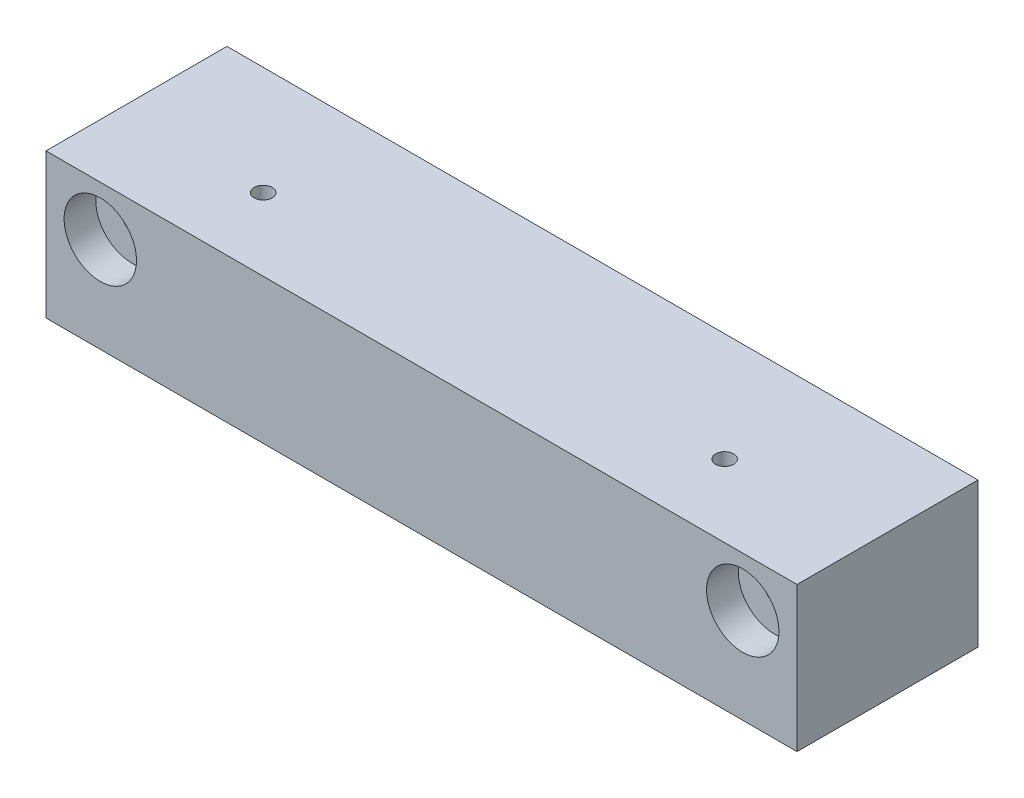
ISO-10303-21;
HEADER;
FILE_DESCRIPTION(('STEP AP214'),'2;1');
FILE_NAME('part.step','',(''),(''),'','','');
FILE_SCHEMA(('AUTOMOTIVE_DESIGN { 1 0 10303 214 1 1 1 1 }'));
ENDSEC;
DATA;
#1=APPLICATION_CONTEXT('core data for automotive mechanical design processes');
#2=APPLICATION_PROTOCOL_DEFINITION('international standard','automotive_design',2000,#1);
#3=PRODUCT_CONTEXT('',#1,'mechanical');
#4=PRODUCT('Part','Part','',(#3));
#5=PRODUCT_RELATED_PRODUCT_CATEGORY('part','',(#4));
#6=PRODUCT_DEFINITION_FORMATION('','',#4);
#7=PRODUCT_DEFINITION_CONTEXT('part definition',#1,'design');
#8=PRODUCT_DEFINITION('design','',#6,#7);
#9=PRODUCT_DEFINITION_SHAPE('','',#8);
#10=(LENGTH_UNIT() NAMED_UNIT(*) SI_UNIT(.MILLI.,.METRE.));
#11=(NAMED_UNIT(*) PLANE_ANGLE_UNIT() SI_UNIT($,.RADIAN.));
#12=(NAMED_UNIT(*) SI_UNIT($,.STERADIAN.) SOLID_ANGLE_UNIT());
#13=UNCERTAINTY_MEASURE_WITH_UNIT(LENGTH_MEASURE(1.E-05),#10,'distance_accuracy_value','');
#14=(GEOMETRIC_REPRESENTATION_CONTEXT(3) GLOBAL_UNCERTAINTY_ASSIGNED_CONTEXT((#13)) GLOBAL_UNIT_ASSIGNED_CONTEXT((#10,
#11,#12)) REPRESENTATION_CONTEXT('',''));
#15=CARTESIAN_POINT('',(0.,0.,0.));
#16=DIRECTION('',(0.,0.,1.));
#17=DIRECTION('',(1.,0.,0.));
#18=AXIS2_PLACEMENT_3D('',#15,#16,#17);
#19=CARTESIAN_POINT('',(41.5,16.,-10.));
#20=DIRECTION('',(-1.,0.,0.));
#21=DIRECTION('',(0.,0.,1.));
#22=AXIS2_PLACEMENT_3D('',#19,#20,#21);
#23=PLANE('',#22);
#24=DIRECTION('',(0.,0.,-1.));
#25=VECTOR('',#24,1.);
#26=CARTESIAN_POINT('',(41.5,0.,-10.));
#27=LINE('',#26,#25);
#28=CARTESIAN_POINT('',(41.5,0.,10.));
#29=VERTEX_POINT('',#28);
#30=CARTESIAN_POINT('',(41.5,0.,-10.));
#31=VERTEX_POINT('',#30);
#32=EDGE_CURVE('E102',#29,#31,#27,.T.);
#33=ORIENTED_EDGE('',*,*,#32,.T.);
#34=DIRECTION('',(0.,-1.,0.));
#35=VECTOR('',#34,1.);
#36=CARTESIAN_POINT('',(41.5,16.,-10.));
#37=LINE('',#36,#35);
#38=CARTESIAN_POINT('',(41.5,16.,-10.));
#39=VERTEX_POINT('',#38);
#40=EDGE_CURVE('E11',#39,#31,#37,.T.);
#41=ORIENTED_EDGE('',*,*,#40,.F.);
#42=DIRECTION('',(0.,0.,-1.));
#43=VECTOR('',#42,1.);
#44=CARTESIAN_POINT('',(41.5,16.,-10.));
#45=LINE('',#44,#43);
#46=CARTESIAN_POINT('',(41.5,16.,10.));
#47=VERTEX_POINT('',#46);
#48=EDGE_CURVE('E90',#47,#39,#45,.T.);
#49=ORIENTED_EDGE('',*,*,#48,.F.);
#50=DIRECTION('',(0.,-1.,0.));
#51=VECTOR('',#50,1.);
#52=CARTESIAN_POINT('',(41.5,16.,10.));
#53=LINE('',#52,#51);
#54=EDGE_CURVE('E98',#47,#29,#53,.T.);
#55=ORIENTED_EDGE('',*,*,#54,.T.);
#56=EDGE_LOOP('',(#33,#41,#49,#55));
#57=FACE_BOUND('',#56,.T.);
#58=ADVANCED_FACE('F39',(#57),#23,.F.);
#59=CARTESIAN_POINT('',(-41.5,16.,-10.));
#60=DIRECTION('',(0.,0.,1.));
#61=DIRECTION('',(1.,0.,0.));
#62=AXIS2_PLACEMENT_3D('',#59,#60,#61);
#63=PLANE('',#62);
#64=DIRECTION('',(-1.,0.,0.));
#65=VECTOR('',#64,1.);
#66=CARTESIAN_POINT('',(-41.5,0.,-10.));
#67=LINE('',#66,#65);
#68=CARTESIAN_POINT('',(-41.5,0.,-10.));
#69=VERTEX_POINT('',#68);
#70=EDGE_CURVE('E94',#31,#69,#67,.T.);
#71=ORIENTED_EDGE('',*,*,#70,.T.);
#72=DIRECTION('',(0.,-1.,0.));
#73=VECTOR('',#72,1.);
#74=CARTESIAN_POINT('',(-41.5,16.,-10.));
#75=LINE('',#74,#73);
#76=CARTESIAN_POINT('',(-41.5,16.,-10.));
#77=VERTEX_POINT('',#76);
#78=EDGE_CURVE('E47',#77,#69,#75,.T.);
#79=ORIENTED_EDGE('',*,*,#78,.F.);
#80=DIRECTION('',(-1.,0.,0.));
#81=VECTOR('',#80,1.);
#82=CARTESIAN_POINT('',(-41.5,16.,-10.));
#83=LINE('',#82,#81);
#84=EDGE_CURVE('E85',#39,#77,#83,.T.);
#85=ORIENTED_EDGE('',*,*,#84,.F.);
#86=ORIENTED_EDGE('',*,*,#40,.T.);
#87=EDGE_LOOP('',(#71,#79,#85,#86));
#88=FACE_BOUND('',#87,.T.);
#89=ADVANCED_FACE('F93',(#88),#63,.F.);
#90=CARTESIAN_POINT('',(-41.5,16.,-10.));
#91=DIRECTION('',(1.,0.,0.));
#92=DIRECTION('',(0.,0.,-1.));
#93=AXIS2_PLACEMENT_3D('',#90,#91,#92);
#94=PLANE('',#93);
#95=DIRECTION('',(0.,0.,1.));
#96=VECTOR('',#95,1.);
#97=CARTESIAN_POINT('',(-41.5,0.,-10.));
#98=LINE('',#97,#96);
#99=CARTESIAN_POINT('',(-41.5,0.,10.));
#100=VERTEX_POINT('',#99);
#101=EDGE_CURVE('E72',#69,#100,#98,.T.);
#102=ORIENTED_EDGE('',*,*,#101,.T.);
#103=DIRECTION('',(0.,-1.,0.));
#104=VECTOR('',#103,1.);
#105=CARTESIAN_POINT('',(-41.5,16.,10.));
#106=LINE('',#105,#104);
#107=CARTESIAN_POINT('',(-41.5,16.,10.));
#108=VERTEX_POINT('',#107);
#109=EDGE_CURVE('E95',#108,#100,#106,.T.);
#110=ORIENTED_EDGE('',*,*,#109,.F.);
#111=DIRECTION('',(0.,0.,1.));
#112=VECTOR('',#111,1.);
#113=CARTESIAN_POINT('',(-41.5,16.,-10.));
#114=LINE('',#113,#112);
#115=EDGE_CURVE('E88',#77,#108,#114,.T.);
#116=ORIENTED_EDGE('',*,*,#115,.F.);
#117=ORIENTED_EDGE('',*,*,#78,.T.);
#118=EDGE_LOOP('',(#102,#110,#116,#117));
#119=FACE_BOUND('',#118,.T.);
#120=ADVANCED_FACE('F96',(#119),#94,.F.);
#121=CARTESIAN_POINT('',(-41.5,16.,10.));
#122=DIRECTION('',(0.,0.,-1.));
#123=DIRECTION('',(-1.,0.,0.));
#124=AXIS2_PLACEMENT_3D('',#121,#122,#123);
#125=PLANE('',#124);
#126=CARTESIAN_POINT('',(-35.5,10.5,10.));
#127=DIRECTION('',(0.,0.,1.));
#128=DIRECTION('',(1.,0.,0.));
#129=AXIS2_PLACEMENT_3D('',#126,#127,#128);
#130=CIRCLE('',#129,4.00000000000001);
#131=CARTESIAN_POINT('',(-31.5,10.5,10.));
#132=VERTEX_POINT('',#131);
#133=EDGE_CURVE('E123',#132,#132,#130,.T.);
#134=ORIENTED_EDGE('',*,*,#133,.F.);
#135=EDGE_LOOP('',(#134));
#136=FACE_BOUND('',#135,.T.);
#137=CARTESIAN_POINT('',(35.5,10.5,10.));
#138=DIRECTION('',(0.,0.,1.));
#139=DIRECTION('',(1.,0.,0.));
#140=AXIS2_PLACEMENT_3D('',#137,#138,#139);
#141=CIRCLE('',#140,4.00000000000001);
#142=CARTESIAN_POINT('',(39.5,10.5,10.));
#143=VERTEX_POINT('',#142);
#144=EDGE_CURVE('E119',#143,#143,#141,.T.);
#145=ORIENTED_EDGE('',*,*,#144,.F.);
#146=EDGE_LOOP('',(#145));
#147=FACE_BOUND('',#146,.T.);
#148=DIRECTION('',(1.,0.,0.));
#149=VECTOR('',#148,1.);
#150=CARTESIAN_POINT('',(-41.5,0.,10.));
#151=LINE('',#150,#149);
#152=EDGE_CURVE('E78',#100,#29,#151,.T.);
#153=ORIENTED_EDGE('',*,*,#152,.T.);
#154=ORIENTED_EDGE('',*,*,#54,.F.);
#155=DIRECTION('',(1.,0.,0.));
#156=VECTOR('',#155,1.);
#157=CARTESIAN_POINT('',(-41.5,16.,10.));
#158=LINE('',#157,#156);
#159=EDGE_CURVE('E55',#108,#47,#158,.T.);
#160=ORIENTED_EDGE('',*,*,#159,.F.);
#161=ORIENTED_EDGE('',*,*,#109,.T.);
#162=EDGE_LOOP('',(#153,#154,#160,#161));
#163=FACE_BOUND('',#162,.T.);
#164=ADVANCED_FACE('F110',(#136,#147,#163),#125,.F.);
#165=CARTESIAN_POINT('',(0.,16.,0.));
#166=DIRECTION('',(0.,1.,0.));
#167=DIRECTION('',(0.,0.,1.));
#168=AXIS2_PLACEMENT_3D('',#165,#166,#167);
#169=PLANE('',#168);
#170=CARTESIAN_POINT('',(-25.5,16.,2.));
#171=DIRECTION('',(0.,1.,0.));
#172=DIRECTION('',(0.,0.,1.));
#173=AXIS2_PLACEMENT_3D('',#170,#171,#172);
#174=CIRCLE('',#173,1.);
#175=CARTESIAN_POINT('',(-25.5,16.,3.));
#176=VERTEX_POINT('',#175);
#177=EDGE_CURVE('E135',#176,#176,#174,.T.);
#178=ORIENTED_EDGE('',*,*,#177,.F.);
#179=EDGE_LOOP('',(#178));
#180=FACE_BOUND('',#179,.T.);
#181=CARTESIAN_POINT('',(25.5,16.,2.));
#182=DIRECTION('',(0.,1.,0.));
#183=DIRECTION('',(0.,0.,1.));
#184=AXIS2_PLACEMENT_3D('',#181,#182,#183);
#185=CIRCLE('',#184,1.);
#186=CARTESIAN_POINT('',(25.5,16.,3.));
#187=VERTEX_POINT('',#186);
#188=EDGE_CURVE('E131',#187,#187,#185,.T.);
#189=ORIENTED_EDGE('',*,*,#188,.F.);
#190=EDGE_LOOP('',(#189));
#191=FACE_BOUND('',#190,.T.);
#192=ORIENTED_EDGE('',*,*,#48,.T.);
#193=ORIENTED_EDGE('',*,*,#84,.T.);
#194=ORIENTED_EDGE('',*,*,#115,.T.);
#195=ORIENTED_EDGE('',*,*,#159,.T.);
#196=EDGE_LOOP('',(#192,#193,#194,#195));
#197=FACE_BOUND('',#196,.T.);
#198=ADVANCED_FACE('F86',(#180,#191,#197),#169,.T.);
#199=CARTESIAN_POINT('',(0.,0.,0.));
#200=DIRECTION('',(0.,1.,0.));
#201=DIRECTION('',(0.,0.,1.));
#202=AXIS2_PLACEMENT_3D('',#199,#200,#201);
#203=PLANE('',#202);
#204=ORIENTED_EDGE('',*,*,#32,.F.);
#205=ORIENTED_EDGE('',*,*,#152,.F.);
#206=ORIENTED_EDGE('',*,*,#101,.F.);
#207=ORIENTED_EDGE('',*,*,#70,.F.);
#208=EDGE_LOOP('',(#204,#205,#206,#207));
#209=FACE_BOUND('',#208,.T.);
#210=ADVANCED_FACE('F113',(#209),#203,.F.);
#211=CARTESIAN_POINT('',(35.5,10.5,6.5));
#212=DIRECTION('',(0.,0.,1.));
#213=DIRECTION('',(1.,0.,0.));
#214=AXIS2_PLACEMENT_3D('',#211,#212,#213);
#215=CYLINDRICAL_SURFACE('',#214,4.00000000000001);
#216=CARTESIAN_POINT('',(35.5,10.5,6.5));
#217=DIRECTION('',(0.,0.,1.));
#218=DIRECTION('',(1.,0.,0.));
#219=AXIS2_PLACEMENT_3D('',#216,#217,#218);
#220=CIRCLE('',#219,4.00000000000001);
#221=CARTESIAN_POINT('',(39.5,10.5,6.5));
#222=VERTEX_POINT('',#221);
#223=EDGE_CURVE('E116',#222,#222,#220,.T.);
#224=ORIENTED_EDGE('',*,*,#223,.F.);
#225=EDGE_LOOP('',(#224));
#226=FACE_BOUND('',#225,.T.);
#227=ORIENTED_EDGE('',*,*,#144,.T.);
#228=EDGE_LOOP('',(#227));
#229=FACE_BOUND('',#228,.T.);
#230=ADVANCED_FACE('F180',(#226,#229),#215,.F.);
#231=CARTESIAN_POINT('',(35.5,10.5,6.5));
#232=DIRECTION('',(0.,0.,1.));
#233=DIRECTION('',(1.,0.,0.));
#234=AXIS2_PLACEMENT_3D('',#231,#232,#233);
#235=PLANE('',#234);
#236=CARTESIAN_POINT('',(35.5,10.5,6.5));
#237=DIRECTION('',(0.,0.,1.));
#238=DIRECTION('',(1.,0.,0.));
#239=AXIS2_PLACEMENT_3D('',#236,#237,#238);
#240=CIRCLE('',#239,0.999999999999998);
#241=CARTESIAN_POINT('',(36.5,10.5,6.5));
#242=VERTEX_POINT('',#241);
#243=EDGE_CURVE('E143',#242,#242,#240,.T.);
#244=ORIENTED_EDGE('',*,*,#243,.F.);
#245=EDGE_LOOP('',(#244));
#246=FACE_BOUND('',#245,.T.);
#247=ORIENTED_EDGE('',*,*,#223,.T.);
#248=EDGE_LOOP('',(#247));
#249=FACE_BOUND('',#248,.T.);
#250=ADVANCED_FACE('F171',(#246,#249),#235,.T.);
#251=CARTESIAN_POINT('',(-35.5,10.5,6.5));
#252=DIRECTION('',(0.,0.,1.));
#253=DIRECTION('',(1.,0.,0.));
#254=AXIS2_PLACEMENT_3D('',#251,#252,#253);
#255=CYLINDRICAL_SURFACE('',#254,4.00000000000001);
#256=CARTESIAN_POINT('',(-35.5,10.5,6.5));
#257=DIRECTION('',(0.,0.,1.));
#258=DIRECTION('',(1.,0.,0.));
#259=AXIS2_PLACEMENT_3D('',#256,#257,#258);
#260=CIRCLE('',#259,4.00000000000001);
#261=CARTESIAN_POINT('',(-31.5,10.5,6.5));
#262=VERTEX_POINT('',#261);
#263=EDGE_CURVE('E105',#262,#262,#260,.T.);
#264=ORIENTED_EDGE('',*,*,#263,.F.);
#265=EDGE_LOOP('',(#264));
#266=FACE_BOUND('',#265,.T.);
#267=ORIENTED_EDGE('',*,*,#133,.T.);
#268=EDGE_LOOP('',(#267));
#269=FACE_BOUND('',#268,.T.);
#270=ADVANCED_FACE('F165',(#266,#269),#255,.F.);
#271=CARTESIAN_POINT('',(-35.5,10.5,6.5));
#272=DIRECTION('',(0.,0.,1.));
#273=DIRECTION('',(1.,0.,0.));
#274=AXIS2_PLACEMENT_3D('',#271,#272,#273);
#275=PLANE('',#274);
#276=CARTESIAN_POINT('',(-35.5,10.5,6.5));
#277=DIRECTION('',(0.,0.,1.));
#278=DIRECTION('',(1.,0.,0.));
#279=AXIS2_PLACEMENT_3D('',#276,#277,#278);
#280=CIRCLE('',#279,0.999999999999998);
#281=CARTESIAN_POINT('',(-34.5,10.5,6.5));
#282=VERTEX_POINT('',#281);
#283=EDGE_CURVE('E146',#282,#282,#280,.T.);
#284=ORIENTED_EDGE('',*,*,#283,.F.);
#285=EDGE_LOOP('',(#284));
#286=FACE_BOUND('',#285,.T.);
#287=ORIENTED_EDGE('',*,*,#263,.T.);
#288=EDGE_LOOP('',(#287));
#289=FACE_BOUND('',#288,.T.);
#290=ADVANCED_FACE('F161',(#286,#289),#275,.T.);
#291=CARTESIAN_POINT('',(25.5,6.,2.));
#292=DIRECTION('',(0.,1.,0.));
#293=DIRECTION('',(0.,0.,1.));
#294=AXIS2_PLACEMENT_3D('',#291,#292,#293);
#295=CYLINDRICAL_SURFACE('',#294,1.);
#296=CARTESIAN_POINT('',(25.5,6.,2.));
#297=DIRECTION('',(0.,1.,0.));
#298=DIRECTION('',(0.,0.,1.));
#299=AXIS2_PLACEMENT_3D('',#296,#297,#298);
#300=CIRCLE('',#299,1.);
#301=CARTESIAN_POINT('',(25.5,6.,3.));
#302=VERTEX_POINT('',#301);
#303=EDGE_CURVE('E128',#302,#302,#300,.T.);
#304=ORIENTED_EDGE('',*,*,#303,.F.);
#305=EDGE_LOOP('',(#304));
#306=FACE_BOUND('',#305,.T.);
#307=ORIENTED_EDGE('',*,*,#188,.T.);
#308=EDGE_LOOP('',(#307));
#309=FACE_BOUND('',#308,.T.);
#310=ADVANCED_FACE('F164',(#306,#309),#295,.F.);
#311=CARTESIAN_POINT('',(25.5,6.,2.));
#312=DIRECTION('',(0.,1.,0.));
#313=DIRECTION('',(0.,0.,1.));
#314=AXIS2_PLACEMENT_3D('',#311,#312,#313);
#315=PLANE('',#314);
#316=ORIENTED_EDGE('',*,*,#303,.T.);
#317=EDGE_LOOP('',(#316));
#318=FACE_BOUND('',#317,.T.);
#319=ADVANCED_FACE('F210',(#318),#315,.T.);
#320=CARTESIAN_POINT('',(-25.5,6.,2.));
#321=DIRECTION('',(0.,1.,0.));
#322=DIRECTION('',(0.,0.,1.));
#323=AXIS2_PLACEMENT_3D('',#320,#321,#322);
#324=CYLINDRICAL_SURFACE('',#323,1.);
#325=CARTESIAN_POINT('',(-25.5,6.,2.));
#326=DIRECTION('',(0.,1.,0.));
#327=DIRECTION('',(0.,0.,1.));
#328=AXIS2_PLACEMENT_3D('',#325,#326,#327);
#329=CIRCLE('',#328,1.);
#330=CARTESIAN_POINT('',(-25.5,6.,3.));
#331=VERTEX_POINT('',#330);
#332=EDGE_CURVE('E120',#331,#331,#329,.T.);
#333=ORIENTED_EDGE('',*,*,#332,.F.);
#334=EDGE_LOOP('',(#333));
#335=FACE_BOUND('',#334,.T.);
#336=ORIENTED_EDGE('',*,*,#177,.T.);
#337=EDGE_LOOP('',(#336));
#338=FACE_BOUND('',#337,.T.);
#339=ADVANCED_FACE('F216',(#335,#338),#324,.F.);
#340=CARTESIAN_POINT('',(-25.5,6.,2.));
#341=DIRECTION('',(0.,1.,0.));
#342=DIRECTION('',(0.,0.,1.));
#343=AXIS2_PLACEMENT_3D('',#340,#341,#342);
#344=PLANE('',#343);
#345=ORIENTED_EDGE('',*,*,#332,.T.);
#346=EDGE_LOOP('',(#345));
#347=FACE_BOUND('',#346,.T.);
#348=ADVANCED_FACE('F157',(#347),#344,.T.);
#349=CARTESIAN_POINT('',(-35.5,10.5,-1.5));
#350=DIRECTION('',(0.,0.,1.));
#351=DIRECTION('',(1.,0.,0.));
#352=AXIS2_PLACEMENT_3D('',#349,#350,#351);
#353=CYLINDRICAL_SURFACE('',#352,0.999999999999998);
#354=CARTESIAN_POINT('',(-35.5,10.5,-1.5));
#355=DIRECTION('',(0.,0.,1.));
#356=DIRECTION('',(1.,0.,0.));
#357=AXIS2_PLACEMENT_3D('',#354,#355,#356);
#358=CIRCLE('',#357,0.999999999999998);
#359=CARTESIAN_POINT('',(-34.5,10.5,-1.5));
#360=VERTEX_POINT('',#359);
#361=EDGE_CURVE('E132',#360,#360,#358,.T.);
#362=ORIENTED_EDGE('',*,*,#361,.F.);
#363=EDGE_LOOP('',(#362));
#364=FACE_BOUND('',#363,.T.);
#365=ORIENTED_EDGE('',*,*,#283,.T.);
#366=EDGE_LOOP('',(#365));
#367=FACE_BOUND('',#366,.T.);
#368=ADVANCED_FACE('F154',(#364,#367),#353,.F.);
#369=CARTESIAN_POINT('',(-35.5,10.5,-1.5));
#370=DIRECTION('',(0.,0.,1.));
#371=DIRECTION('',(1.,0.,0.));
#372=AXIS2_PLACEMENT_3D('',#369,#370,#371);
#373=PLANE('',#372);
#374=ORIENTED_EDGE('',*,*,#361,.T.);
#375=EDGE_LOOP('',(#374));
#376=FACE_BOUND('',#375,.T.);
#377=ADVANCED_FACE('F152',(#376),#373,.T.);
#378=CARTESIAN_POINT('',(35.5,10.5,-1.5));
#379=DIRECTION('',(0.,0.,1.));
#380=DIRECTION('',(1.,0.,0.));
#381=AXIS2_PLACEMENT_3D('',#378,#379,#380);
#382=CYLINDRICAL_SURFACE('',#381,0.999999999999998);
#383=CARTESIAN_POINT('',(35.5,10.5,-1.5));
#384=DIRECTION('',(0.,0.,1.));
#385=DIRECTION('',(1.,0.,0.));
#386=AXIS2_PLACEMENT_3D('',#383,#384,#385);
#387=CIRCLE('',#386,0.999999999999998);
#388=CARTESIAN_POINT('',(36.5,10.5,-1.5));
#389=VERTEX_POINT('',#388);
#390=EDGE_CURVE('E140',#389,#389,#387,.T.);
#391=ORIENTED_EDGE('',*,*,#390,.F.);
#392=EDGE_LOOP('',(#391));
#393=FACE_BOUND('',#392,.T.);
#394=ORIENTED_EDGE('',*,*,#243,.T.);
#395=EDGE_LOOP('',(#394));
#396=FACE_BOUND('',#395,.T.);
#397=ADVANCED_FACE('F230',(#393,#396),#382,.F.);
#398=CARTESIAN_POINT('',(35.5,10.5,-1.5));
#399=DIRECTION('',(0.,0.,1.));
#400=DIRECTION('',(1.,0.,0.));
#401=AXIS2_PLACEMENT_3D('',#398,#399,#400);
#402=PLANE('',#401);
#403=ORIENTED_EDGE('',*,*,#390,.T.);
#404=EDGE_LOOP('',(#403));
#405=FACE_BOUND('',#404,.T.);
#406=ADVANCED_FACE('F227',(#405),#402,.T.);
#407=CLOSED_SHELL('',(#58,#89,#120,#164,#198,#210,#230,#250,#270,#290,#310,#319,#339,#348,#368,
#377,#397,#406));
#408=MANIFOLD_SOLID_BREP('B2',#407);
#409=ADVANCED_BREP_SHAPE_REPRESENTATION('',(#18,#408),#14);
#410=SHAPE_DEFINITION_REPRESENTATION(#9,#409);
ENDSEC;
END-ISO-10303-21;
